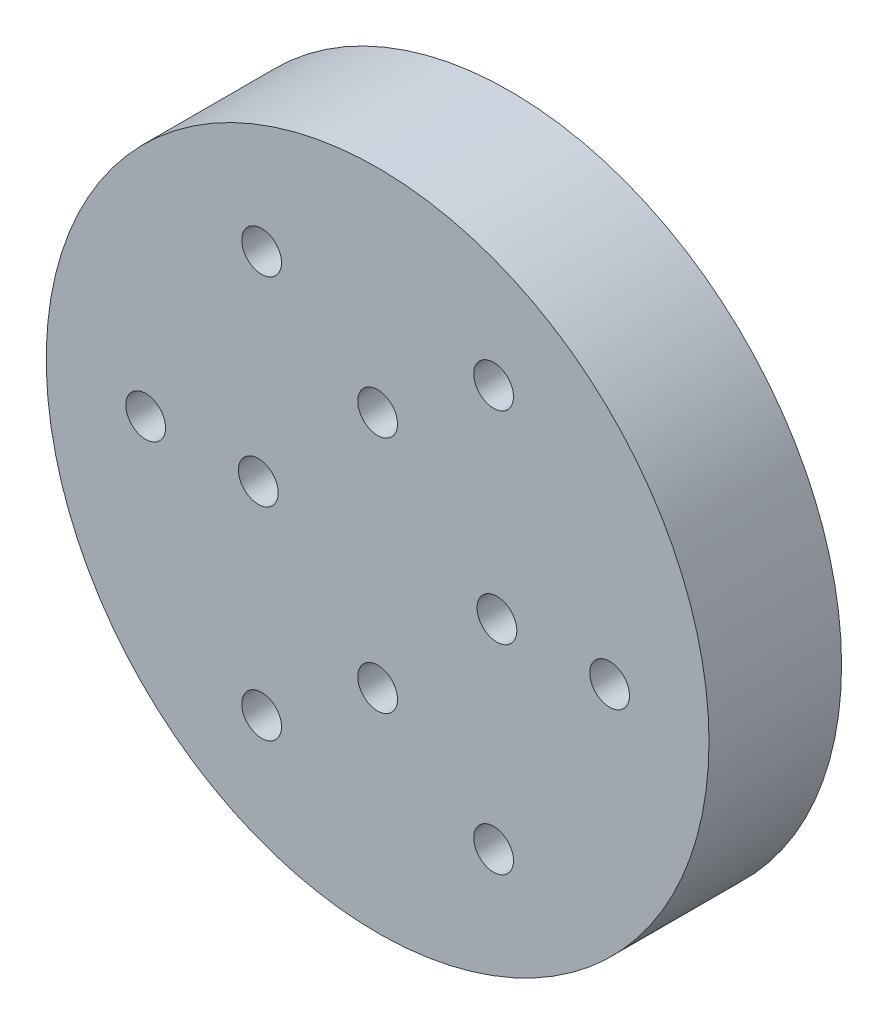
ISO-10303-21;
HEADER;
FILE_DESCRIPTION(('STEP AP214'),'2;1');
FILE_NAME('part.step','',(''),(''),'','','');
FILE_SCHEMA(('AUTOMOTIVE_DESIGN { 1 0 10303 214 1 1 1 1 }'));
ENDSEC;
DATA;
#1=APPLICATION_CONTEXT('core data for automotive mechanical design processes');
#2=APPLICATION_PROTOCOL_DEFINITION('international standard','automotive_design',2000,#1);
#3=PRODUCT_CONTEXT('',#1,'mechanical');
#4=PRODUCT('Part','Part','',(#3));
#5=PRODUCT_RELATED_PRODUCT_CATEGORY('part','',(#4));
#6=PRODUCT_DEFINITION_FORMATION('','',#4);
#7=PRODUCT_DEFINITION_CONTEXT('part definition',#1,'design');
#8=PRODUCT_DEFINITION('design','',#6,#7);
#9=PRODUCT_DEFINITION_SHAPE('','',#8);
#10=(LENGTH_UNIT() NAMED_UNIT(*) SI_UNIT(.MILLI.,.METRE.));
#11=(NAMED_UNIT(*) PLANE_ANGLE_UNIT() SI_UNIT($,.RADIAN.));
#12=(NAMED_UNIT(*) SI_UNIT($,.STERADIAN.) SOLID_ANGLE_UNIT());
#13=UNCERTAINTY_MEASURE_WITH_UNIT(LENGTH_MEASURE(1.E-05),#10,'distance_accuracy_value','');
#14=(GEOMETRIC_REPRESENTATION_CONTEXT(3) GLOBAL_UNCERTAINTY_ASSIGNED_CONTEXT((#13)) GLOBAL_UNIT_ASSIGNED_CONTEXT((#10,
#11,#12)) REPRESENTATION_CONTEXT('',''));
#15=CARTESIAN_POINT('',(0.,0.,0.));
#16=DIRECTION('',(0.,0.,1.));
#17=DIRECTION('',(1.,0.,0.));
#18=AXIS2_PLACEMENT_3D('',#15,#16,#17);
#19=CARTESIAN_POINT('',(0.,0.,20.));
#20=DIRECTION('',(0.,0.,-1.));
#21=DIRECTION('',(-1.,0.,0.));
#22=AXIS2_PLACEMENT_3D('',#19,#20,#21);
#23=CYLINDRICAL_SURFACE('',#22,50.);
#24=CARTESIAN_POINT('',(0.,0.,20.));
#25=DIRECTION('',(0.,0.,1.));
#26=DIRECTION('',(1.,0.,0.));
#27=AXIS2_PLACEMENT_3D('',#24,#25,#26);
#28=CIRCLE('',#27,50.);
#29=CARTESIAN_POINT('',(50.,0.,20.));
#30=VERTEX_POINT('',#29);
#31=EDGE_CURVE('E47',#30,#30,#28,.T.);
#32=ORIENTED_EDGE('',*,*,#31,.F.);
#33=EDGE_LOOP('',(#32));
#34=FACE_BOUND('',#33,.T.);
#35=CARTESIAN_POINT('',(0.,0.,0.));
#36=DIRECTION('',(0.,0.,1.));
#37=DIRECTION('',(1.,0.,0.));
#38=AXIS2_PLACEMENT_3D('',#35,#36,#37);
#39=CIRCLE('',#38,50.);
#40=CARTESIAN_POINT('',(50.,0.,0.));
#41=VERTEX_POINT('',#40);
#42=EDGE_CURVE('E82',#41,#41,#39,.T.);
#43=ORIENTED_EDGE('',*,*,#42,.T.);
#44=EDGE_LOOP('',(#43));
#45=FACE_BOUND('',#44,.T.);
#46=ADVANCED_FACE('F39',(#34,#45),#23,.T.);
#47=CARTESIAN_POINT('',(17.4999999999997,-30.3108891324555,20.));
#48=DIRECTION('',(0.,0.,-1.));
#49=DIRECTION('',(-1.,0.,0.));
#50=AXIS2_PLACEMENT_3D('',#47,#48,#49);
#51=CYLINDRICAL_SURFACE('',#50,3.);
#52=CARTESIAN_POINT('',(17.4999999999997,-30.3108891324555,20.));
#53=DIRECTION('',(0.,0.,1.));
#54=DIRECTION('',(1.,0.,0.));
#55=AXIS2_PLACEMENT_3D('',#52,#53,#54);
#56=CIRCLE('',#55,3.);
#57=CARTESIAN_POINT('',(20.4999999999997,-30.3108891324555,20.));
#58=VERTEX_POINT('',#57);
#59=EDGE_CURVE('E52',#58,#58,#56,.T.);
#60=ORIENTED_EDGE('',*,*,#59,.T.);
#61=EDGE_LOOP('',(#60));
#62=FACE_BOUND('',#61,.T.);
#63=CARTESIAN_POINT('',(17.4999999999997,-30.3108891324555,0.));
#64=DIRECTION('',(0.,0.,1.));
#65=DIRECTION('',(1.,0.,0.));
#66=AXIS2_PLACEMENT_3D('',#63,#64,#65);
#67=CIRCLE('',#66,3.);
#68=CARTESIAN_POINT('',(20.4999999999997,-30.3108891324555,0.));
#69=VERTEX_POINT('',#68);
#70=EDGE_CURVE('E80',#69,#69,#67,.T.);
#71=ORIENTED_EDGE('',*,*,#70,.F.);
#72=EDGE_LOOP('',(#71));
#73=FACE_BOUND('',#72,.T.);
#74=ADVANCED_FACE('F118',(#62,#73),#51,.F.);
#75=CARTESIAN_POINT('',(35.,-2.44403693719019E-13,20.));
#76=DIRECTION('',(0.,0.,-1.));
#77=DIRECTION('',(-1.,0.,0.));
#78=AXIS2_PLACEMENT_3D('',#75,#76,#77);
#79=CYLINDRICAL_SURFACE('',#78,3.);
#80=CARTESIAN_POINT('',(35.,-2.44403693719019E-13,20.));
#81=DIRECTION('',(0.,0.,1.));
#82=DIRECTION('',(1.,0.,0.));
#83=AXIS2_PLACEMENT_3D('',#80,#81,#82);
#84=CIRCLE('',#83,3.);
#85=CARTESIAN_POINT('',(38.,-2.44403693719019E-13,20.));
#86=VERTEX_POINT('',#85);
#87=EDGE_CURVE('E113',#86,#86,#84,.T.);
#88=ORIENTED_EDGE('',*,*,#87,.T.);
#89=EDGE_LOOP('',(#88));
#90=FACE_BOUND('',#89,.T.);
#91=CARTESIAN_POINT('',(35.,-2.44403693719019E-13,0.));
#92=DIRECTION('',(0.,0.,1.));
#93=DIRECTION('',(1.,0.,0.));
#94=AXIS2_PLACEMENT_3D('',#91,#92,#93);
#95=CIRCLE('',#94,3.);
#96=CARTESIAN_POINT('',(38.,-2.44403693719019E-13,0.));
#97=VERTEX_POINT('',#96);
#98=EDGE_CURVE('E77',#97,#97,#95,.T.);
#99=ORIENTED_EDGE('',*,*,#98,.F.);
#100=EDGE_LOOP('',(#99));
#101=FACE_BOUND('',#100,.T.);
#102=ADVANCED_FACE('F136',(#90,#101),#79,.F.);
#103=CARTESIAN_POINT('',(17.5000000000001,30.3108891324553,20.));
#104=DIRECTION('',(0.,0.,-1.));
#105=DIRECTION('',(-1.,0.,0.));
#106=AXIS2_PLACEMENT_3D('',#103,#104,#105);
#107=CYLINDRICAL_SURFACE('',#106,3.);
#108=CARTESIAN_POINT('',(17.5000000000001,30.3108891324553,20.));
#109=DIRECTION('',(0.,0.,1.));
#110=DIRECTION('',(1.,0.,0.));
#111=AXIS2_PLACEMENT_3D('',#108,#109,#110);
#112=CIRCLE('',#111,3.);
#113=CARTESIAN_POINT('',(20.5000000000001,30.3108891324553,20.));
#114=VERTEX_POINT('',#113);
#115=EDGE_CURVE('E110',#114,#114,#112,.T.);
#116=ORIENTED_EDGE('',*,*,#115,.T.);
#117=EDGE_LOOP('',(#116));
#118=FACE_BOUND('',#117,.T.);
#119=CARTESIAN_POINT('',(17.5000000000001,30.3108891324553,0.));
#120=DIRECTION('',(0.,0.,1.));
#121=DIRECTION('',(1.,0.,0.));
#122=AXIS2_PLACEMENT_3D('',#119,#120,#121);
#123=CIRCLE('',#122,3.);
#124=CARTESIAN_POINT('',(20.5000000000001,30.3108891324553,0.));
#125=VERTEX_POINT('',#124);
#126=EDGE_CURVE('E74',#125,#125,#123,.T.);
#127=ORIENTED_EDGE('',*,*,#126,.F.);
#128=EDGE_LOOP('',(#127));
#129=FACE_BOUND('',#128,.T.);
#130=ADVANCED_FACE('F143',(#118,#129),#107,.F.);
#131=CARTESIAN_POINT('',(-17.4999999999999,30.3108891324554,20.));
#132=DIRECTION('',(0.,0.,-1.));
#133=DIRECTION('',(-1.,0.,0.));
#134=AXIS2_PLACEMENT_3D('',#131,#132,#133);
#135=CYLINDRICAL_SURFACE('',#134,3.);
#136=CARTESIAN_POINT('',(-17.4999999999999,30.3108891324554,20.));
#137=DIRECTION('',(0.,0.,1.));
#138=DIRECTION('',(1.,0.,0.));
#139=AXIS2_PLACEMENT_3D('',#136,#137,#138);
#140=CIRCLE('',#139,3.);
#141=CARTESIAN_POINT('',(-14.4999999999999,30.3108891324554,20.));
#142=VERTEX_POINT('',#141);
#143=EDGE_CURVE('E107',#142,#142,#140,.T.);
#144=ORIENTED_EDGE('',*,*,#143,.T.);
#145=EDGE_LOOP('',(#144));
#146=FACE_BOUND('',#145,.T.);
#147=CARTESIAN_POINT('',(-17.4999999999999,30.3108891324554,0.));
#148=DIRECTION('',(0.,0.,1.));
#149=DIRECTION('',(1.,0.,0.));
#150=AXIS2_PLACEMENT_3D('',#147,#148,#149);
#151=CIRCLE('',#150,3.);
#152=CARTESIAN_POINT('',(-14.4999999999999,30.3108891324554,0.));
#153=VERTEX_POINT('',#152);
#154=EDGE_CURVE('E71',#153,#153,#151,.T.);
#155=ORIENTED_EDGE('',*,*,#154,.F.);
#156=EDGE_LOOP('',(#155));
#157=FACE_BOUND('',#156,.T.);
#158=ADVANCED_FACE('F147',(#146,#157),#135,.F.);
#159=CARTESIAN_POINT('',(-35.,0.,20.));
#160=DIRECTION('',(0.,0.,-1.));
#161=DIRECTION('',(-1.,0.,0.));
#162=AXIS2_PLACEMENT_3D('',#159,#160,#161);
#163=CYLINDRICAL_SURFACE('',#162,3.);
#164=CARTESIAN_POINT('',(-35.,0.,20.));
#165=DIRECTION('',(0.,0.,1.));
#166=DIRECTION('',(1.,0.,0.));
#167=AXIS2_PLACEMENT_3D('',#164,#165,#166);
#168=CIRCLE('',#167,3.);
#169=CARTESIAN_POINT('',(-32.,0.,20.));
#170=VERTEX_POINT('',#169);
#171=EDGE_CURVE('E104',#170,#170,#168,.T.);
#172=ORIENTED_EDGE('',*,*,#171,.T.);
#173=EDGE_LOOP('',(#172));
#174=FACE_BOUND('',#173,.T.);
#175=CARTESIAN_POINT('',(-35.,0.,0.));
#176=DIRECTION('',(0.,0.,1.));
#177=DIRECTION('',(1.,0.,0.));
#178=AXIS2_PLACEMENT_3D('',#175,#176,#177);
#179=CIRCLE('',#178,3.);
#180=CARTESIAN_POINT('',(-32.,0.,0.));
#181=VERTEX_POINT('',#180);
#182=EDGE_CURVE('E68',#181,#181,#179,.T.);
#183=ORIENTED_EDGE('',*,*,#182,.F.);
#184=EDGE_LOOP('',(#183));
#185=FACE_BOUND('',#184,.T.);
#186=ADVANCED_FACE('F151',(#174,#185),#163,.F.);
#187=CARTESIAN_POINT('',(-17.5000000000004,-30.3108891324552,20.));
#188=DIRECTION('',(0.,0.,-1.));
#189=DIRECTION('',(-1.,0.,0.));
#190=AXIS2_PLACEMENT_3D('',#187,#188,#189);
#191=CYLINDRICAL_SURFACE('',#190,3.);
#192=CARTESIAN_POINT('',(-17.5000000000004,-30.3108891324552,20.));
#193=DIRECTION('',(0.,0.,1.));
#194=DIRECTION('',(1.,0.,0.));
#195=AXIS2_PLACEMENT_3D('',#192,#193,#194);
#196=CIRCLE('',#195,3.);
#197=CARTESIAN_POINT('',(-14.5000000000004,-30.3108891324552,20.));
#198=VERTEX_POINT('',#197);
#199=EDGE_CURVE('E101',#198,#198,#196,.T.);
#200=ORIENTED_EDGE('',*,*,#199,.T.);
#201=EDGE_LOOP('',(#200));
#202=FACE_BOUND('',#201,.T.);
#203=CARTESIAN_POINT('',(-17.5000000000004,-30.3108891324552,0.));
#204=DIRECTION('',(0.,0.,1.));
#205=DIRECTION('',(1.,0.,0.));
#206=AXIS2_PLACEMENT_3D('',#203,#204,#205);
#207=CIRCLE('',#206,3.);
#208=CARTESIAN_POINT('',(-14.5000000000004,-30.3108891324552,0.));
#209=VERTEX_POINT('',#208);
#210=EDGE_CURVE('E65',#209,#209,#207,.T.);
#211=ORIENTED_EDGE('',*,*,#210,.F.);
#212=EDGE_LOOP('',(#211));
#213=FACE_BOUND('',#212,.T.);
#214=ADVANCED_FACE('F155',(#202,#213),#191,.F.);
#215=CARTESIAN_POINT('',(0.,18.,20.));
#216=DIRECTION('',(0.,0.,-1.));
#217=DIRECTION('',(-1.,0.,0.));
#218=AXIS2_PLACEMENT_3D('',#215,#216,#217);
#219=CYLINDRICAL_SURFACE('',#218,3.);
#220=CARTESIAN_POINT('',(0.,18.,20.));
#221=DIRECTION('',(0.,0.,1.));
#222=DIRECTION('',(1.,0.,0.));
#223=AXIS2_PLACEMENT_3D('',#220,#221,#222);
#224=CIRCLE('',#223,3.);
#225=CARTESIAN_POINT('',(3.00000000000006,18.,20.));
#226=VERTEX_POINT('',#225);
#227=EDGE_CURVE('E96',#226,#226,#224,.T.);
#228=ORIENTED_EDGE('',*,*,#227,.T.);
#229=EDGE_LOOP('',(#228));
#230=FACE_BOUND('',#229,.T.);
#231=CARTESIAN_POINT('',(0.,18.,0.));
#232=DIRECTION('',(0.,0.,1.));
#233=DIRECTION('',(1.,0.,0.));
#234=AXIS2_PLACEMENT_3D('',#231,#232,#233);
#235=CIRCLE('',#234,3.);
#236=CARTESIAN_POINT('',(3.00000000000006,18.,0.));
#237=VERTEX_POINT('',#236);
#238=EDGE_CURVE('E62',#237,#237,#235,.T.);
#239=ORIENTED_EDGE('',*,*,#238,.F.);
#240=EDGE_LOOP('',(#239));
#241=FACE_BOUND('',#240,.T.);
#242=ADVANCED_FACE('F159',(#230,#241),#219,.F.);
#243=CARTESIAN_POINT('',(-18.,0.,20.));
#244=DIRECTION('',(0.,0.,-1.));
#245=DIRECTION('',(-1.,0.,0.));
#246=AXIS2_PLACEMENT_3D('',#243,#244,#245);
#247=CYLINDRICAL_SURFACE('',#246,3.);
#248=CARTESIAN_POINT('',(-18.,0.,20.));
#249=DIRECTION('',(0.,0.,1.));
#250=DIRECTION('',(1.,0.,0.));
#251=AXIS2_PLACEMENT_3D('',#248,#249,#250);
#252=CIRCLE('',#251,3.);
#253=CARTESIAN_POINT('',(-15.,0.,20.));
#254=VERTEX_POINT('',#253);
#255=EDGE_CURVE('E91',#254,#254,#252,.T.);
#256=ORIENTED_EDGE('',*,*,#255,.T.);
#257=EDGE_LOOP('',(#256));
#258=FACE_BOUND('',#257,.T.);
#259=CARTESIAN_POINT('',(-18.,0.,0.));
#260=DIRECTION('',(0.,0.,1.));
#261=DIRECTION('',(1.,0.,0.));
#262=AXIS2_PLACEMENT_3D('',#259,#260,#261);
#263=CIRCLE('',#262,3.);
#264=CARTESIAN_POINT('',(-15.,0.,0.));
#265=VERTEX_POINT('',#264);
#266=EDGE_CURVE('E59',#265,#265,#263,.T.);
#267=ORIENTED_EDGE('',*,*,#266,.F.);
#268=EDGE_LOOP('',(#267));
#269=FACE_BOUND('',#268,.T.);
#270=ADVANCED_FACE('F162',(#258,#269),#247,.F.);
#271=CARTESIAN_POINT('',(-1.88539992297529E-13,-18.,20.));
#272=DIRECTION('',(0.,0.,-1.));
#273=DIRECTION('',(-1.,0.,0.));
#274=AXIS2_PLACEMENT_3D('',#271,#272,#273);
#275=CYLINDRICAL_SURFACE('',#274,3.);
#276=CARTESIAN_POINT('',(-1.88539992297529E-13,-18.,20.));
#277=DIRECTION('',(0.,0.,1.));
#278=DIRECTION('',(1.,0.,0.));
#279=AXIS2_PLACEMENT_3D('',#276,#277,#278);
#280=CIRCLE('',#279,3.);
#281=CARTESIAN_POINT('',(2.99999999999981,-18.,20.));
#282=VERTEX_POINT('',#281);
#283=EDGE_CURVE('E87',#282,#282,#280,.T.);
#284=ORIENTED_EDGE('',*,*,#283,.T.);
#285=EDGE_LOOP('',(#284));
#286=FACE_BOUND('',#285,.T.);
#287=CARTESIAN_POINT('',(-1.88539992297529E-13,-18.,0.));
#288=DIRECTION('',(0.,0.,1.));
#289=DIRECTION('',(1.,0.,0.));
#290=AXIS2_PLACEMENT_3D('',#287,#288,#289);
#291=CIRCLE('',#290,3.);
#292=CARTESIAN_POINT('',(2.99999999999981,-18.,0.));
#293=VERTEX_POINT('',#292);
#294=EDGE_CURVE('E56',#293,#293,#291,.T.);
#295=ORIENTED_EDGE('',*,*,#294,.F.);
#296=EDGE_LOOP('',(#295));
#297=FACE_BOUND('',#296,.T.);
#298=ADVANCED_FACE('F41',(#286,#297),#275,.F.);
#299=CARTESIAN_POINT('',(18.,-1.25693328198353E-13,20.));
#300=DIRECTION('',(0.,0.,-1.));
#301=DIRECTION('',(-1.,0.,0.));
#302=AXIS2_PLACEMENT_3D('',#299,#300,#301);
#303=CYLINDRICAL_SURFACE('',#302,3.);
#304=CARTESIAN_POINT('',(18.,-1.25693328198353E-13,20.));
#305=DIRECTION('',(0.,0.,1.));
#306=DIRECTION('',(1.,0.,0.));
#307=AXIS2_PLACEMENT_3D('',#304,#305,#306);
#308=CIRCLE('',#307,3.);
#309=CARTESIAN_POINT('',(21.,-1.25693328198353E-13,20.));
#310=VERTEX_POINT('',#309);
#311=EDGE_CURVE('E10',#310,#310,#308,.T.);
#312=ORIENTED_EDGE('',*,*,#311,.T.);
#313=EDGE_LOOP('',(#312));
#314=FACE_BOUND('',#313,.T.);
#315=CARTESIAN_POINT('',(18.,-1.25693328198353E-13,0.));
#316=DIRECTION('',(0.,0.,1.));
#317=DIRECTION('',(1.,0.,0.));
#318=AXIS2_PLACEMENT_3D('',#315,#316,#317);
#319=CIRCLE('',#318,3.);
#320=CARTESIAN_POINT('',(21.,-1.25693328198353E-13,0.));
#321=VERTEX_POINT('',#320);
#322=EDGE_CURVE('E43',#321,#321,#319,.T.);
#323=ORIENTED_EDGE('',*,*,#322,.F.);
#324=EDGE_LOOP('',(#323));
#325=FACE_BOUND('',#324,.T.);
#326=ADVANCED_FACE('F125',(#314,#325),#303,.F.);
#327=CARTESIAN_POINT('',(0.,0.,20.));
#328=DIRECTION('',(0.,0.,1.));
#329=DIRECTION('',(1.,0.,0.));
#330=AXIS2_PLACEMENT_3D('',#327,#328,#329);
#331=PLANE('',#330);
#332=ORIENTED_EDGE('',*,*,#283,.F.);
#333=EDGE_LOOP('',(#332));
#334=FACE_BOUND('',#333,.T.);
#335=ORIENTED_EDGE('',*,*,#255,.F.);
#336=EDGE_LOOP('',(#335));
#337=FACE_BOUND('',#336,.T.);
#338=ORIENTED_EDGE('',*,*,#227,.F.);
#339=EDGE_LOOP('',(#338));
#340=FACE_BOUND('',#339,.T.);
#341=ORIENTED_EDGE('',*,*,#199,.F.);
#342=EDGE_LOOP('',(#341));
#343=FACE_BOUND('',#342,.T.);
#344=ORIENTED_EDGE('',*,*,#171,.F.);
#345=EDGE_LOOP('',(#344));
#346=FACE_BOUND('',#345,.T.);
#347=ORIENTED_EDGE('',*,*,#143,.F.);
#348=EDGE_LOOP('',(#347));
#349=FACE_BOUND('',#348,.T.);
#350=ORIENTED_EDGE('',*,*,#115,.F.);
#351=EDGE_LOOP('',(#350));
#352=FACE_BOUND('',#351,.T.);
#353=ORIENTED_EDGE('',*,*,#87,.F.);
#354=EDGE_LOOP('',(#353));
#355=FACE_BOUND('',#354,.T.);
#356=ORIENTED_EDGE('',*,*,#59,.F.);
#357=EDGE_LOOP('',(#356));
#358=FACE_BOUND('',#357,.T.);
#359=ORIENTED_EDGE('',*,*,#31,.T.);
#360=EDGE_LOOP('',(#359));
#361=FACE_BOUND('',#360,.T.);
#362=ORIENTED_EDGE('',*,*,#311,.F.);
#363=EDGE_LOOP('',(#362));
#364=FACE_BOUND('',#363,.T.);
#365=ADVANCED_FACE('F121',(#334,#337,#340,#343,#346,#349,#352,#355,#358,#361,#364),#331,.T.);
#366=CARTESIAN_POINT('',(0.,0.,0.));
#367=DIRECTION('',(0.,0.,1.));
#368=DIRECTION('',(1.,0.,0.));
#369=AXIS2_PLACEMENT_3D('',#366,#367,#368);
#370=PLANE('',#369);
#371=ORIENTED_EDGE('',*,*,#294,.T.);
#372=EDGE_LOOP('',(#371));
#373=FACE_BOUND('',#372,.T.);
#374=ORIENTED_EDGE('',*,*,#266,.T.);
#375=EDGE_LOOP('',(#374));
#376=FACE_BOUND('',#375,.T.);
#377=ORIENTED_EDGE('',*,*,#238,.T.);
#378=EDGE_LOOP('',(#377));
#379=FACE_BOUND('',#378,.T.);
#380=ORIENTED_EDGE('',*,*,#210,.T.);
#381=EDGE_LOOP('',(#380));
#382=FACE_BOUND('',#381,.T.);
#383=ORIENTED_EDGE('',*,*,#182,.T.);
#384=EDGE_LOOP('',(#383));
#385=FACE_BOUND('',#384,.T.);
#386=ORIENTED_EDGE('',*,*,#154,.T.);
#387=EDGE_LOOP('',(#386));
#388=FACE_BOUND('',#387,.T.);
#389=ORIENTED_EDGE('',*,*,#126,.T.);
#390=EDGE_LOOP('',(#389));
#391=FACE_BOUND('',#390,.T.);
#392=ORIENTED_EDGE('',*,*,#98,.T.);
#393=EDGE_LOOP('',(#392));
#394=FACE_BOUND('',#393,.T.);
#395=ORIENTED_EDGE('',*,*,#70,.T.);
#396=EDGE_LOOP('',(#395));
#397=FACE_BOUND('',#396,.T.);
#398=ORIENTED_EDGE('',*,*,#42,.F.);
#399=EDGE_LOOP('',(#398));
#400=FACE_BOUND('',#399,.T.);
#401=ORIENTED_EDGE('',*,*,#322,.T.);
#402=EDGE_LOOP('',(#401));
#403=FACE_BOUND('',#402,.T.);
#404=ADVANCED_FACE('F124',(#373,#376,#379,#382,#385,#388,#391,#394,#397,#400,#403),#370,.F.);
#405=CLOSED_SHELL('',(#46,#74,#102,#130,#158,#186,#214,#242,#270,#298,#326,#365,#404));
#406=MANIFOLD_SOLID_BREP('B2',#405);
#407=ADVANCED_BREP_SHAPE_REPRESENTATION('',(#18,#406),#14);
#408=SHAPE_DEFINITION_REPRESENTATION(#9,#407);
ENDSEC;
END-ISO-10303-21;
